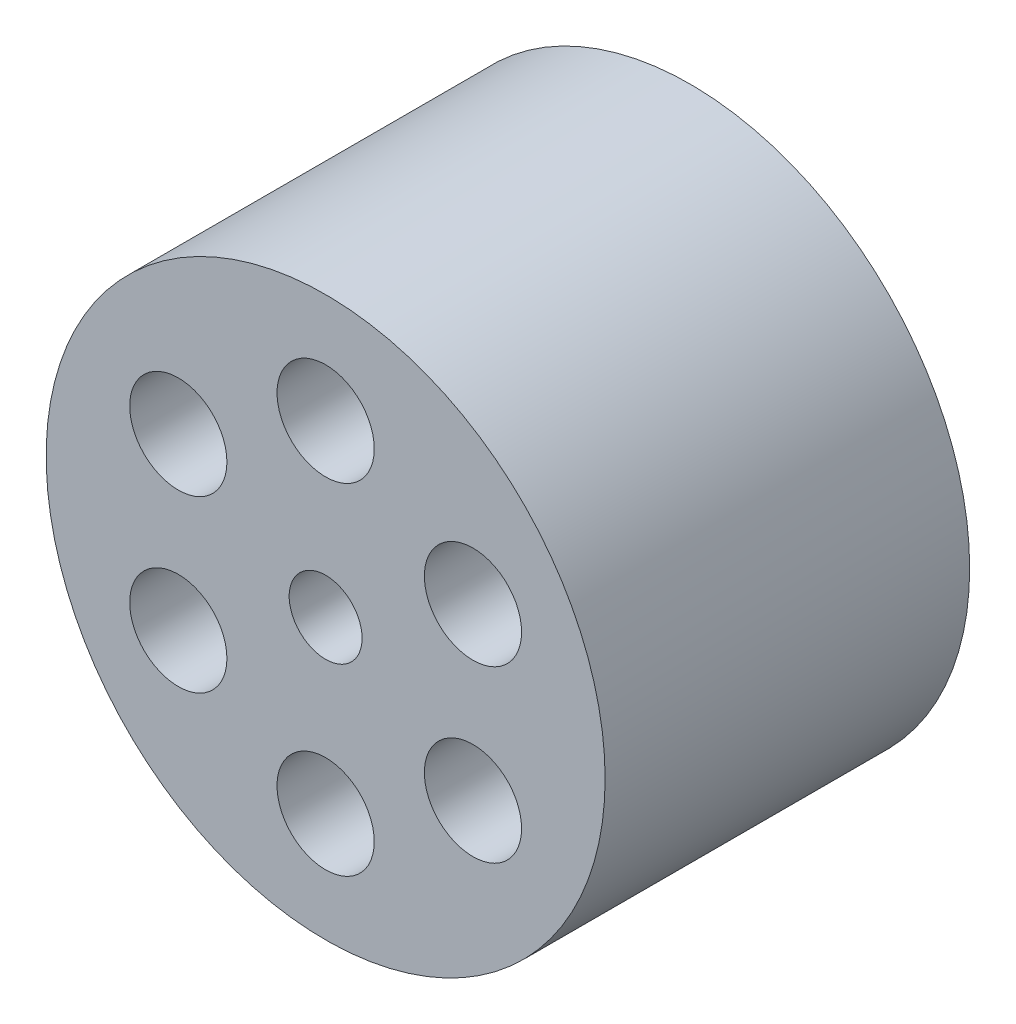
ISO-10303-21;
HEADER;
FILE_DESCRIPTION(('STEP AP214'),'2;1');
FILE_NAME('part.step','',(''),(''),'','','');
FILE_SCHEMA(('AUTOMOTIVE_DESIGN { 1 0 10303 214 1 1 1 1 }'));
ENDSEC;
DATA;
#1=APPLICATION_CONTEXT('core data for automotive mechanical design processes');
#2=APPLICATION_PROTOCOL_DEFINITION('international standard','automotive_design',2000,#1);
#3=PRODUCT_CONTEXT('',#1,'mechanical');
#4=PRODUCT('Part','Part','',(#3));
#5=PRODUCT_RELATED_PRODUCT_CATEGORY('part','',(#4));
#6=PRODUCT_DEFINITION_FORMATION('','',#4);
#7=PRODUCT_DEFINITION_CONTEXT('part definition',#1,'design');
#8=PRODUCT_DEFINITION('design','',#6,#7);
#9=PRODUCT_DEFINITION_SHAPE('','',#8);
#10=(LENGTH_UNIT() NAMED_UNIT(*) SI_UNIT(.MILLI.,.METRE.));
#11=(NAMED_UNIT(*) PLANE_ANGLE_UNIT() SI_UNIT($,.RADIAN.));
#12=(NAMED_UNIT(*) SI_UNIT($,.STERADIAN.) SOLID_ANGLE_UNIT());
#13=UNCERTAINTY_MEASURE_WITH_UNIT(LENGTH_MEASURE(1.E-05),#10,'distance_accuracy_value','');
#14=(GEOMETRIC_REPRESENTATION_CONTEXT(3) GLOBAL_UNCERTAINTY_ASSIGNED_CONTEXT((#13)) GLOBAL_UNIT_ASSIGNED_CONTEXT((#10,
#11,#12)) REPRESENTATION_CONTEXT('',''));
#15=CARTESIAN_POINT('',(0.,0.,0.));
#16=DIRECTION('',(0.,0.,1.));
#17=DIRECTION('',(1.,0.,0.));
#18=AXIS2_PLACEMENT_3D('',#15,#16,#17);
#19=CARTESIAN_POINT('',(0.,0.,30.));
#20=DIRECTION('',(0.,0.,1.));
#21=DIRECTION('',(1.,0.,0.));
#22=AXIS2_PLACEMENT_3D('',#19,#20,#21);
#23=PLANE('',#22);
#24=CARTESIAN_POINT('',(-12.1243556529821,-7.00000000000001,30.));
#25=DIRECTION('',(0.,0.,1.));
#26=DIRECTION('',(1.,0.,0.));
#27=AXIS2_PLACEMENT_3D('',#24,#25,#26);
#28=CIRCLE('',#27,4.);
#29=CARTESIAN_POINT('',(-8.12435565298214,-7.00000000000001,30.));
#30=VERTEX_POINT('',#29);
#31=EDGE_CURVE('E71',#30,#30,#28,.T.);
#32=ORIENTED_EDGE('',*,*,#31,.F.);
#33=EDGE_LOOP('',(#32));
#34=FACE_BOUND('',#33,.T.);
#35=CARTESIAN_POINT('',(12.1243556529821,-7.,30.));
#36=DIRECTION('',(0.,0.,1.));
#37=DIRECTION('',(1.,0.,0.));
#38=AXIS2_PLACEMENT_3D('',#35,#36,#37);
#39=CIRCLE('',#38,4.);
#40=CARTESIAN_POINT('',(16.1243556529821,-7.,30.));
#41=VERTEX_POINT('',#40);
#42=EDGE_CURVE('E59',#41,#41,#39,.T.);
#43=ORIENTED_EDGE('',*,*,#42,.F.);
#44=EDGE_LOOP('',(#43));
#45=FACE_BOUND('',#44,.T.);
#46=CARTESIAN_POINT('',(0.,14.,30.));
#47=DIRECTION('',(0.,0.,1.));
#48=DIRECTION('',(1.,0.,0.));
#49=AXIS2_PLACEMENT_3D('',#46,#47,#48);
#50=CIRCLE('',#49,4.);
#51=CARTESIAN_POINT('',(4.,14.,30.));
#52=VERTEX_POINT('',#51);
#53=EDGE_CURVE('E47',#52,#52,#50,.T.);
#54=ORIENTED_EDGE('',*,*,#53,.F.);
#55=EDGE_LOOP('',(#54));
#56=FACE_BOUND('',#55,.T.);
#57=CARTESIAN_POINT('',(0.,0.,30.));
#58=DIRECTION('',(0.,0.,1.));
#59=DIRECTION('',(1.,0.,0.));
#60=AXIS2_PLACEMENT_3D('',#57,#58,#59);
#61=CIRCLE('',#60,23.);
#62=CARTESIAN_POINT('',(23.,0.,30.));
#63=VERTEX_POINT('',#62);
#64=EDGE_CURVE('E10',#63,#63,#61,.T.);
#65=ORIENTED_EDGE('',*,*,#64,.T.);
#66=EDGE_LOOP('',(#65));
#67=FACE_BOUND('',#66,.T.);
#68=CARTESIAN_POINT('',(0.,0.,30.));
#69=DIRECTION('',(0.,0.,1.));
#70=DIRECTION('',(1.,0.,0.));
#71=AXIS2_PLACEMENT_3D('',#68,#69,#70);
#72=CIRCLE('',#71,3.);
#73=CARTESIAN_POINT('',(3.,0.,30.));
#74=VERTEX_POINT('',#73);
#75=EDGE_CURVE('E42',#74,#74,#72,.T.);
#76=ORIENTED_EDGE('',*,*,#75,.F.);
#77=EDGE_LOOP('',(#76));
#78=FACE_BOUND('',#77,.T.);
#79=CARTESIAN_POINT('',(12.1243556529821,7.,30.));
#80=DIRECTION('',(0.,0.,1.));
#81=DIRECTION('',(1.,0.,0.));
#82=AXIS2_PLACEMENT_3D('',#79,#80,#81);
#83=CIRCLE('',#82,4.);
#84=CARTESIAN_POINT('',(16.1243556529821,7.,30.));
#85=VERTEX_POINT('',#84);
#86=EDGE_CURVE('E53',#85,#85,#83,.T.);
#87=ORIENTED_EDGE('',*,*,#86,.F.);
#88=EDGE_LOOP('',(#87));
#89=FACE_BOUND('',#88,.T.);
#90=CARTESIAN_POINT('',(0.,-14.,30.));
#91=DIRECTION('',(0.,0.,1.));
#92=DIRECTION('',(1.,0.,0.));
#93=AXIS2_PLACEMENT_3D('',#90,#91,#92);
#94=CIRCLE('',#93,4.);
#95=CARTESIAN_POINT('',(4.,-14.,30.));
#96=VERTEX_POINT('',#95);
#97=EDGE_CURVE('E65',#96,#96,#94,.T.);
#98=ORIENTED_EDGE('',*,*,#97,.F.);
#99=EDGE_LOOP('',(#98));
#100=FACE_BOUND('',#99,.T.);
#101=CARTESIAN_POINT('',(-12.1243556529821,6.99999999999999,30.));
#102=DIRECTION('',(0.,0.,1.));
#103=DIRECTION('',(1.,0.,0.));
#104=AXIS2_PLACEMENT_3D('',#101,#102,#103);
#105=CIRCLE('',#104,4.);
#106=CARTESIAN_POINT('',(-8.12435565298215,6.99999999999999,30.));
#107=VERTEX_POINT('',#106);
#108=EDGE_CURVE('E77',#107,#107,#105,.T.);
#109=ORIENTED_EDGE('',*,*,#108,.F.);
#110=EDGE_LOOP('',(#109));
#111=FACE_BOUND('',#110,.T.);
#112=ADVANCED_FACE('F31',(#34,#45,#56,#67,#78,#89,#100,#111),#23,.T.);
#113=CARTESIAN_POINT('',(0.,0.,0.));
#114=DIRECTION('',(0.,0.,1.));
#115=DIRECTION('',(1.,0.,0.));
#116=AXIS2_PLACEMENT_3D('',#113,#114,#115);
#117=PLANE('',#116);
#118=CARTESIAN_POINT('',(0.,0.,0.));
#119=DIRECTION('',(0.,0.,1.));
#120=DIRECTION('',(1.,0.,0.));
#121=AXIS2_PLACEMENT_3D('',#118,#119,#120);
#122=CIRCLE('',#121,23.);
#123=CARTESIAN_POINT('',(23.,0.,0.));
#124=VERTEX_POINT('',#123);
#125=EDGE_CURVE('E35',#124,#124,#122,.T.);
#126=ORIENTED_EDGE('',*,*,#125,.F.);
#127=EDGE_LOOP('',(#126));
#128=FACE_BOUND('',#127,.T.);
#129=CARTESIAN_POINT('',(0.,0.,0.));
#130=DIRECTION('',(0.,0.,1.));
#131=DIRECTION('',(1.,0.,0.));
#132=AXIS2_PLACEMENT_3D('',#129,#130,#131);
#133=CIRCLE('',#132,3.);
#134=CARTESIAN_POINT('',(3.,0.,0.));
#135=VERTEX_POINT('',#134);
#136=EDGE_CURVE('E44',#135,#135,#133,.T.);
#137=ORIENTED_EDGE('',*,*,#136,.T.);
#138=EDGE_LOOP('',(#137));
#139=FACE_BOUND('',#138,.T.);
#140=CARTESIAN_POINT('',(0.,14.,0.));
#141=DIRECTION('',(0.,0.,1.));
#142=DIRECTION('',(1.,0.,0.));
#143=AXIS2_PLACEMENT_3D('',#140,#141,#142);
#144=CIRCLE('',#143,4.);
#145=CARTESIAN_POINT('',(4.,14.,0.));
#146=VERTEX_POINT('',#145);
#147=EDGE_CURVE('E50',#146,#146,#144,.T.);
#148=ORIENTED_EDGE('',*,*,#147,.T.);
#149=EDGE_LOOP('',(#148));
#150=FACE_BOUND('',#149,.T.);
#151=CARTESIAN_POINT('',(12.1243556529821,7.,0.));
#152=DIRECTION('',(0.,0.,1.));
#153=DIRECTION('',(1.,0.,0.));
#154=AXIS2_PLACEMENT_3D('',#151,#152,#153);
#155=CIRCLE('',#154,4.);
#156=CARTESIAN_POINT('',(16.1243556529821,7.,0.));
#157=VERTEX_POINT('',#156);
#158=EDGE_CURVE('E56',#157,#157,#155,.T.);
#159=ORIENTED_EDGE('',*,*,#158,.T.);
#160=EDGE_LOOP('',(#159));
#161=FACE_BOUND('',#160,.T.);
#162=CARTESIAN_POINT('',(12.1243556529821,-7.,0.));
#163=DIRECTION('',(0.,0.,1.));
#164=DIRECTION('',(1.,0.,0.));
#165=AXIS2_PLACEMENT_3D('',#162,#163,#164);
#166=CIRCLE('',#165,4.);
#167=CARTESIAN_POINT('',(16.1243556529821,-7.,0.));
#168=VERTEX_POINT('',#167);
#169=EDGE_CURVE('E62',#168,#168,#166,.T.);
#170=ORIENTED_EDGE('',*,*,#169,.T.);
#171=EDGE_LOOP('',(#170));
#172=FACE_BOUND('',#171,.T.);
#173=CARTESIAN_POINT('',(0.,-14.,0.));
#174=DIRECTION('',(0.,0.,1.));
#175=DIRECTION('',(1.,0.,0.));
#176=AXIS2_PLACEMENT_3D('',#173,#174,#175);
#177=CIRCLE('',#176,4.);
#178=CARTESIAN_POINT('',(4.,-14.,0.));
#179=VERTEX_POINT('',#178);
#180=EDGE_CURVE('E68',#179,#179,#177,.T.);
#181=ORIENTED_EDGE('',*,*,#180,.T.);
#182=EDGE_LOOP('',(#181));
#183=FACE_BOUND('',#182,.T.);
#184=CARTESIAN_POINT('',(-12.1243556529821,-7.00000000000001,0.));
#185=DIRECTION('',(0.,0.,1.));
#186=DIRECTION('',(1.,0.,0.));
#187=AXIS2_PLACEMENT_3D('',#184,#185,#186);
#188=CIRCLE('',#187,4.);
#189=CARTESIAN_POINT('',(-8.12435565298214,-7.00000000000001,0.));
#190=VERTEX_POINT('',#189);
#191=EDGE_CURVE('E74',#190,#190,#188,.T.);
#192=ORIENTED_EDGE('',*,*,#191,.T.);
#193=EDGE_LOOP('',(#192));
#194=FACE_BOUND('',#193,.T.);
#195=CARTESIAN_POINT('',(-12.1243556529821,6.99999999999999,0.));
#196=DIRECTION('',(0.,0.,1.));
#197=DIRECTION('',(1.,0.,0.));
#198=AXIS2_PLACEMENT_3D('',#195,#196,#197);
#199=CIRCLE('',#198,4.);
#200=CARTESIAN_POINT('',(-8.12435565298215,6.99999999999999,0.));
#201=VERTEX_POINT('',#200);
#202=EDGE_CURVE('E80',#201,#201,#199,.T.);
#203=ORIENTED_EDGE('',*,*,#202,.T.);
#204=EDGE_LOOP('',(#203));
#205=FACE_BOUND('',#204,.T.);
#206=ADVANCED_FACE('F90',(#128,#139,#150,#161,#172,#183,#194,#205),#117,.F.);
#207=CARTESIAN_POINT('',(0.,0.,30.));
#208=DIRECTION('',(0.,0.,-1.));
#209=DIRECTION('',(-1.,0.,0.));
#210=AXIS2_PLACEMENT_3D('',#207,#208,#209);
#211=CYLINDRICAL_SURFACE('',#210,23.);
#212=ORIENTED_EDGE('',*,*,#64,.F.);
#213=EDGE_LOOP('',(#212));
#214=FACE_BOUND('',#213,.T.);
#215=ORIENTED_EDGE('',*,*,#125,.T.);
#216=EDGE_LOOP('',(#215));
#217=FACE_BOUND('',#216,.T.);
#218=ADVANCED_FACE('F33',(#214,#217),#211,.T.);
#219=CARTESIAN_POINT('',(0.,0.,30.));
#220=DIRECTION('',(0.,0.,-1.));
#221=DIRECTION('',(-1.,0.,0.));
#222=AXIS2_PLACEMENT_3D('',#219,#220,#221);
#223=CYLINDRICAL_SURFACE('',#222,3.);
#224=ORIENTED_EDGE('',*,*,#75,.T.);
#225=EDGE_LOOP('',(#224));
#226=FACE_BOUND('',#225,.T.);
#227=ORIENTED_EDGE('',*,*,#136,.F.);
#228=EDGE_LOOP('',(#227));
#229=FACE_BOUND('',#228,.T.);
#230=ADVANCED_FACE('F100',(#226,#229),#223,.F.);
#231=CARTESIAN_POINT('',(0.,14.,30.));
#232=DIRECTION('',(0.,0.,-1.));
#233=DIRECTION('',(-1.,0.,0.));
#234=AXIS2_PLACEMENT_3D('',#231,#232,#233);
#235=CYLINDRICAL_SURFACE('',#234,4.);
#236=ORIENTED_EDGE('',*,*,#53,.T.);
#237=EDGE_LOOP('',(#236));
#238=FACE_BOUND('',#237,.T.);
#239=ORIENTED_EDGE('',*,*,#147,.F.);
#240=EDGE_LOOP('',(#239));
#241=FACE_BOUND('',#240,.T.);
#242=ADVANCED_FACE('F103',(#238,#241),#235,.F.);
#243=CARTESIAN_POINT('',(12.1243556529821,7.,30.));
#244=DIRECTION('',(0.,0.,-1.));
#245=DIRECTION('',(-1.,0.,0.));
#246=AXIS2_PLACEMENT_3D('',#243,#244,#245);
#247=CYLINDRICAL_SURFACE('',#246,4.);
#248=ORIENTED_EDGE('',*,*,#86,.T.);
#249=EDGE_LOOP('',(#248));
#250=FACE_BOUND('',#249,.T.);
#251=ORIENTED_EDGE('',*,*,#158,.F.);
#252=EDGE_LOOP('',(#251));
#253=FACE_BOUND('',#252,.T.);
#254=ADVANCED_FACE('F107',(#250,#253),#247,.F.);
#255=CARTESIAN_POINT('',(12.1243556529821,-7.,30.));
#256=DIRECTION('',(0.,0.,-1.));
#257=DIRECTION('',(-1.,0.,0.));
#258=AXIS2_PLACEMENT_3D('',#255,#256,#257);
#259=CYLINDRICAL_SURFACE('',#258,4.);
#260=ORIENTED_EDGE('',*,*,#42,.T.);
#261=EDGE_LOOP('',(#260));
#262=FACE_BOUND('',#261,.T.);
#263=ORIENTED_EDGE('',*,*,#169,.F.);
#264=EDGE_LOOP('',(#263));
#265=FACE_BOUND('',#264,.T.);
#266=ADVANCED_FACE('F111',(#262,#265),#259,.F.);
#267=CARTESIAN_POINT('',(0.,-14.,30.));
#268=DIRECTION('',(0.,0.,-1.));
#269=DIRECTION('',(-1.,0.,0.));
#270=AXIS2_PLACEMENT_3D('',#267,#268,#269);
#271=CYLINDRICAL_SURFACE('',#270,4.);
#272=ORIENTED_EDGE('',*,*,#97,.T.);
#273=EDGE_LOOP('',(#272));
#274=FACE_BOUND('',#273,.T.);
#275=ORIENTED_EDGE('',*,*,#180,.F.);
#276=EDGE_LOOP('',(#275));
#277=FACE_BOUND('',#276,.T.);
#278=ADVANCED_FACE('F115',(#274,#277),#271,.F.);
#279=CARTESIAN_POINT('',(-12.1243556529821,-7.00000000000001,30.));
#280=DIRECTION('',(0.,0.,-1.));
#281=DIRECTION('',(-1.,0.,0.));
#282=AXIS2_PLACEMENT_3D('',#279,#280,#281);
#283=CYLINDRICAL_SURFACE('',#282,4.);
#284=ORIENTED_EDGE('',*,*,#31,.T.);
#285=EDGE_LOOP('',(#284));
#286=FACE_BOUND('',#285,.T.);
#287=ORIENTED_EDGE('',*,*,#191,.F.);
#288=EDGE_LOOP('',(#287));
#289=FACE_BOUND('',#288,.T.);
#290=ADVANCED_FACE('F119',(#286,#289),#283,.F.);
#291=CARTESIAN_POINT('',(-12.1243556529821,6.99999999999999,30.));
#292=DIRECTION('',(0.,0.,-1.));
#293=DIRECTION('',(-1.,0.,0.));
#294=AXIS2_PLACEMENT_3D('',#291,#292,#293);
#295=CYLINDRICAL_SURFACE('',#294,4.);
#296=ORIENTED_EDGE('',*,*,#108,.T.);
#297=EDGE_LOOP('',(#296));
#298=FACE_BOUND('',#297,.T.);
#299=ORIENTED_EDGE('',*,*,#202,.F.);
#300=EDGE_LOOP('',(#299));
#301=FACE_BOUND('',#300,.T.);
#302=ADVANCED_FACE('F86',(#298,#301),#295,.F.);
#303=CLOSED_SHELL('',(#112,#206,#218,#230,#242,#254,#266,#278,#290,#302));
#304=MANIFOLD_SOLID_BREP('B2',#303);
#305=ADVANCED_BREP_SHAPE_REPRESENTATION('',(#18,#304),#14);
#306=SHAPE_DEFINITION_REPRESENTATION(#9,#305);
ENDSEC;
END-ISO-10303-21;
